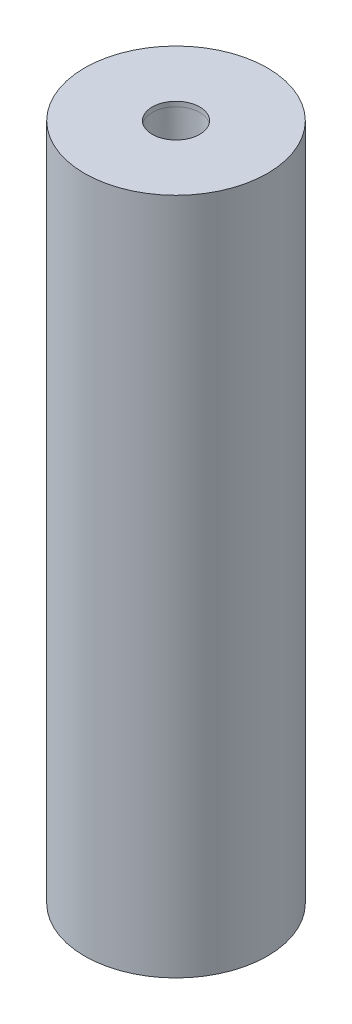
ISO-10303-21;
HEADER;
FILE_DESCRIPTION(('STEP AP214'),'2;1');
FILE_NAME('part.step','',(''),(''),'','','');
FILE_SCHEMA(('AUTOMOTIVE_DESIGN { 1 0 10303 214 1 1 1 1 }'));
ENDSEC;
DATA;
#1=APPLICATION_CONTEXT('core data for automotive mechanical design processes');
#2=APPLICATION_PROTOCOL_DEFINITION('international standard','automotive_design',2000,#1);
#3=PRODUCT_CONTEXT('',#1,'mechanical');
#4=PRODUCT('Part','Part','',(#3));
#5=PRODUCT_RELATED_PRODUCT_CATEGORY('part','',(#4));
#6=PRODUCT_DEFINITION_FORMATION('','',#4);
#7=PRODUCT_DEFINITION_CONTEXT('part definition',#1,'design');
#8=PRODUCT_DEFINITION('design','',#6,#7);
#9=PRODUCT_DEFINITION_SHAPE('','',#8);
#10=(LENGTH_UNIT() NAMED_UNIT(*) SI_UNIT(.MILLI.,.METRE.));
#11=(NAMED_UNIT(*) PLANE_ANGLE_UNIT() SI_UNIT($,.RADIAN.));
#12=(NAMED_UNIT(*) SI_UNIT($,.STERADIAN.) SOLID_ANGLE_UNIT());
#13=UNCERTAINTY_MEASURE_WITH_UNIT(LENGTH_MEASURE(1.E-05),#10,'distance_accuracy_value','');
#14=(GEOMETRIC_REPRESENTATION_CONTEXT(3) GLOBAL_UNCERTAINTY_ASSIGNED_CONTEXT((#13)) GLOBAL_UNIT_ASSIGNED_CONTEXT((#10,
#11,#12)) REPRESENTATION_CONTEXT('',''));
#15=CARTESIAN_POINT('',(0.,0.,0.));
#16=DIRECTION('',(0.,0.,1.));
#17=DIRECTION('',(1.,0.,0.));
#18=AXIS2_PLACEMENT_3D('',#15,#16,#17);
#19=CARTESIAN_POINT('',(0.,1.,0.));
#20=DIRECTION('',(0.,-1.,0.));
#21=DIRECTION('',(0.,0.,-1.));
#22=AXIS2_PLACEMENT_3D('',#19,#20,#21);
#23=PLANE('',#22);
#24=CARTESIAN_POINT('',(0.,1.,0.));
#25=DIRECTION('',(0.,-1.,0.));
#26=DIRECTION('',(0.,0.,-1.));
#27=AXIS2_PLACEMENT_3D('',#24,#25,#26);
#28=CIRCLE('',#27,2.51745506492823);
#29=CARTESIAN_POINT('',(0.,1.,-2.51745506492823));
#30=VERTEX_POINT('',#29);
#31=EDGE_CURVE('E10',#30,#30,#28,.T.);
#32=ORIENTED_EDGE('',*,*,#31,.F.);
#33=EDGE_LOOP('',(#32));
#34=FACE_BOUND('',#33,.T.);
#35=ADVANCED_FACE('F39',(#34),#23,.F.);
#36=CARTESIAN_POINT('',(0.,1.,0.));
#37=DIRECTION('',(0.,1.,0.));
#38=DIRECTION('',(0.,0.,1.));
#39=AXIS2_PLACEMENT_3D('',#36,#37,#38);
#40=CONICAL_SURFACE('',#39,2.51745506492823,0.0174532925199535);
#41=CARTESIAN_POINT('',(0.,140.,0.));
#42=DIRECTION('',(0.,-1.,0.));
#43=DIRECTION('',(0.,0.,-1.));
#44=AXIS2_PLACEMENT_3D('',#41,#42,#43);
#45=CIRCLE('',#44,4.94370908995189);
#46=CARTESIAN_POINT('',(0.,140.,-4.94370908995189));
#47=VERTEX_POINT('',#46);
#48=EDGE_CURVE('E44',#47,#47,#45,.T.);
#49=ORIENTED_EDGE('',*,*,#48,.F.);
#50=EDGE_LOOP('',(#49));
#51=FACE_BOUND('',#50,.T.);
#52=ORIENTED_EDGE('',*,*,#31,.T.);
#53=EDGE_LOOP('',(#52));
#54=FACE_BOUND('',#53,.T.);
#55=ADVANCED_FACE('F225',(#51,#54),#40,.F.);
#56=CARTESIAN_POINT('',(0.,0.,0.));
#57=DIRECTION('',(0.,-1.,0.));
#58=DIRECTION('',(0.,0.,-1.));
#59=AXIS2_PLACEMENT_3D('',#56,#57,#58);
#60=CYLINDRICAL_SURFACE('',#59,4.94370908995142);
#61=CARTESIAN_POINT('',(0.,141.,0.));
#62=DIRECTION('',(0.,-1.,0.));
#63=DIRECTION('',(0.,0.,-1.));
#64=AXIS2_PLACEMENT_3D('',#61,#62,#63);
#65=CIRCLE('',#64,4.94370908995096);
#66=CARTESIAN_POINT('',(0.,141.,-4.94370908995096));
#67=VERTEX_POINT('',#66);
#68=EDGE_CURVE('E47',#67,#67,#65,.T.);
#69=ORIENTED_EDGE('',*,*,#68,.F.);
#70=EDGE_LOOP('',(#69));
#71=FACE_BOUND('',#70,.T.);
#72=ORIENTED_EDGE('',*,*,#48,.T.);
#73=EDGE_LOOP('',(#72));
#74=FACE_BOUND('',#73,.T.);
#75=ADVANCED_FACE('F220',(#71,#74),#60,.F.);
#76=CARTESIAN_POINT('',(-19.0210585061275,141.,0.));
#77=DIRECTION('',(0.,-1.,0.));
#78=DIRECTION('',(0.,0.,-1.));
#79=AXIS2_PLACEMENT_3D('',#76,#77,#78);
#80=PLANE('',#79);
#81=CARTESIAN_POINT('',(0.,141.,0.));
#82=DIRECTION('',(0.,-1.,0.));
#83=DIRECTION('',(0.,0.,-1.));
#84=AXIS2_PLACEMENT_3D('',#81,#82,#83);
#85=CIRCLE('',#84,19.0210585061275);
#86=CARTESIAN_POINT('',(0.,141.,-19.0210585061275));
#87=VERTEX_POINT('',#86);
#88=EDGE_CURVE('E52',#87,#87,#85,.T.);
#89=ORIENTED_EDGE('',*,*,#88,.F.);
#90=EDGE_LOOP('',(#89));
#91=FACE_BOUND('',#90,.T.);
#92=ORIENTED_EDGE('',*,*,#68,.T.);
#93=EDGE_LOOP('',(#92));
#94=FACE_BOUND('',#93,.T.);
#95=ADVANCED_FACE('F211',(#91,#94),#80,.F.);
#96=CARTESIAN_POINT('',(0.,0.,0.));
#97=DIRECTION('',(0.,-1.,0.));
#98=DIRECTION('',(0.,0.,-1.));
#99=AXIS2_PLACEMENT_3D('',#96,#97,#98);
#100=CYLINDRICAL_SURFACE('',#99,19.021058506127);
#101=CARTESIAN_POINT('',(0.,0.,0.));
#102=DIRECTION('',(0.,-1.,0.));
#103=DIRECTION('',(0.,0.,-1.));
#104=AXIS2_PLACEMENT_3D('',#101,#102,#103);
#105=CIRCLE('',#104,19.0210585061265);
#106=CARTESIAN_POINT('',(0.,0.,-19.0210585061265));
#107=VERTEX_POINT('',#106);
#108=EDGE_CURVE('E59',#107,#107,#105,.T.);
#109=ORIENTED_EDGE('',*,*,#108,.F.);
#110=EDGE_LOOP('',(#109));
#111=FACE_BOUND('',#110,.T.);
#112=ORIENTED_EDGE('',*,*,#88,.T.);
#113=EDGE_LOOP('',(#112));
#114=FACE_BOUND('',#113,.T.);
#115=ADVANCED_FACE('F202',(#111,#114),#100,.T.);
#116=CARTESIAN_POINT('',(-19.0210585061265,0.,0.));
#117=DIRECTION('',(0.,1.,0.));
#118=DIRECTION('',(0.,0.,1.));
#119=AXIS2_PLACEMENT_3D('',#116,#117,#118);
#120=PLANE('',#119);
#121=CARTESIAN_POINT('',(0.,-1.08469887890646E-13,0.));
#122=DIRECTION('',(0.,-1.,0.));
#123=DIRECTION('',(0.,0.,-1.));
#124=AXIS2_PLACEMENT_3D('',#121,#122,#123);
#125=CIRCLE('',#124,15.5773494161756);
#126=CARTESIAN_POINT('',(0.,-1.08469887890646E-13,-15.5773494161756));
#127=VERTEX_POINT('',#126);
#128=EDGE_CURVE('E64',#127,#127,#125,.T.);
#129=ORIENTED_EDGE('',*,*,#128,.F.);
#130=EDGE_LOOP('',(#129));
#131=FACE_BOUND('',#130,.T.);
#132=ORIENTED_EDGE('',*,*,#108,.T.);
#133=EDGE_LOOP('',(#132));
#134=FACE_BOUND('',#133,.T.);
#135=ADVANCED_FACE('F200',(#131,#134),#120,.F.);
#136=CARTESIAN_POINT('',(0.,-1.08469887890646E-13,0.));
#137=DIRECTION('',(0.,1.,0.));
#138=DIRECTION('',(0.,0.,1.));
#139=AXIS2_PLACEMENT_3D('',#136,#137,#138);
#140=CONICAL_SURFACE('',#139,15.5773494161756,0.0174532925199466);
#141=CARTESIAN_POINT('',(0.,140.,0.));
#142=DIRECTION('',(0.,-1.,0.));
#143=DIRECTION('',(0.,0.,-1.));
#144=AXIS2_PLACEMENT_3D('',#141,#142,#143);
#145=CIRCLE('',#144,18.0210585061266);
#146=CARTESIAN_POINT('',(0.,140.,-18.0210585061266));
#147=VERTEX_POINT('',#146);
#148=EDGE_CURVE('E63',#147,#147,#145,.T.);
#149=ORIENTED_EDGE('',*,*,#148,.F.);
#150=EDGE_LOOP('',(#149));
#151=FACE_BOUND('',#150,.T.);
#152=ORIENTED_EDGE('',*,*,#128,.T.);
#153=EDGE_LOOP('',(#152));
#154=FACE_BOUND('',#153,.T.);
#155=ADVANCED_FACE('F191',(#151,#154),#140,.F.);
#156=CARTESIAN_POINT('',(-18.0210585061266,140.,0.));
#157=DIRECTION('',(0.,1.,0.));
#158=DIRECTION('',(0.,0.,1.));
#159=AXIS2_PLACEMENT_3D('',#156,#157,#158);
#160=PLANE('',#159);
#161=CARTESIAN_POINT('',(0.,140.,0.));
#162=DIRECTION('',(0.,-1.,0.));
#163=DIRECTION('',(0.,0.,-1.));
#164=AXIS2_PLACEMENT_3D('',#161,#162,#163);
#165=CIRCLE('',#164,15.7518734801275);
#166=CARTESIAN_POINT('',(0.,140.,-15.7518734801275));
#167=VERTEX_POINT('',#166);
#168=EDGE_CURVE('E70',#167,#167,#165,.T.);
#169=ORIENTED_EDGE('',*,*,#168,.F.);
#170=EDGE_LOOP('',(#169));
#171=FACE_BOUND('',#170,.T.);
#172=ORIENTED_EDGE('',*,*,#148,.T.);
#173=EDGE_LOOP('',(#172));
#174=FACE_BOUND('',#173,.T.);
#175=ADVANCED_FACE('F186',(#171,#174),#160,.F.);
#176=CARTESIAN_POINT('',(0.,140.,0.));
#177=DIRECTION('',(0.,1.,0.));
#178=DIRECTION('',(0.,0.,1.));
#179=AXIS2_PLACEMENT_3D('',#176,#177,#178);
#180=CONICAL_SURFACE('',#179,15.7518734801275,0.0174532925199535);
#181=CARTESIAN_POINT('',(0.,0.,0.));
#182=DIRECTION('',(0.,-1.,0.));
#183=DIRECTION('',(0.,0.,-1.));
#184=AXIS2_PLACEMENT_3D('',#181,#182,#183);
#185=CIRCLE('',#184,13.3081643901756);
#186=CARTESIAN_POINT('',(0.,0.,-13.3081643901756));
#187=VERTEX_POINT('',#186);
#188=EDGE_CURVE('E67',#187,#187,#185,.T.);
#189=ORIENTED_EDGE('',*,*,#188,.F.);
#190=EDGE_LOOP('',(#189));
#191=FACE_BOUND('',#190,.T.);
#192=ORIENTED_EDGE('',*,*,#168,.T.);
#193=EDGE_LOOP('',(#192));
#194=FACE_BOUND('',#193,.T.);
#195=ADVANCED_FACE('F182',(#191,#194),#180,.T.);
#196=CARTESIAN_POINT('',(-13.3081643901756,0.,0.));
#197=DIRECTION('',(0.,1.,0.));
#198=DIRECTION('',(0.,0.,1.));
#199=AXIS2_PLACEMENT_3D('',#196,#197,#198);
#200=PLANE('',#199);
#201=CARTESIAN_POINT('',(0.,0.,0.));
#202=DIRECTION('',(0.,-1.,0.));
#203=DIRECTION('',(0.,0.,-1.));
#204=AXIS2_PLACEMENT_3D('',#201,#202,#203);
#205=CIRCLE('',#204,12.3080120621317);
#206=CARTESIAN_POINT('',(0.,0.,-12.3080120621317));
#207=VERTEX_POINT('',#206);
#208=EDGE_CURVE('E71',#207,#207,#205,.T.);
#209=ORIENTED_EDGE('',*,*,#208,.F.);
#210=EDGE_LOOP('',(#209));
#211=FACE_BOUND('',#210,.T.);
#212=ORIENTED_EDGE('',*,*,#188,.T.);
#213=EDGE_LOOP('',(#212));
#214=FACE_BOUND('',#213,.T.);
#215=ADVANCED_FACE('F172',(#211,#214),#200,.F.);
#216=CARTESIAN_POINT('',(0.,0.,0.));
#217=DIRECTION('',(0.,1.,0.));
#218=DIRECTION('',(0.,0.,1.));
#219=AXIS2_PLACEMENT_3D('',#216,#217,#218);
#220=CONICAL_SURFACE('',#219,12.3080120621317,0.0174532925199534);
#221=CARTESIAN_POINT('',(0.,140.,0.));
#222=DIRECTION('',(0.,-1.,0.));
#223=DIRECTION('',(0.,0.,-1.));
#224=AXIS2_PLACEMENT_3D('',#221,#222,#223);
#225=CIRCLE('',#224,14.7517211520836);
#226=CARTESIAN_POINT('',(0.,140.,-14.7517211520836));
#227=VERTEX_POINT('',#226);
#228=EDGE_CURVE('E79',#227,#227,#225,.T.);
#229=ORIENTED_EDGE('',*,*,#228,.F.);
#230=EDGE_LOOP('',(#229));
#231=FACE_BOUND('',#230,.T.);
#232=ORIENTED_EDGE('',*,*,#208,.T.);
#233=EDGE_LOOP('',(#232));
#234=FACE_BOUND('',#233,.T.);
#235=ADVANCED_FACE('F166',(#231,#234),#220,.F.);
#236=CARTESIAN_POINT('',(-14.7517211520836,140.,0.));
#237=DIRECTION('',(0.,1.,0.));
#238=DIRECTION('',(0.,0.,1.));
#239=AXIS2_PLACEMENT_3D('',#236,#237,#238);
#240=PLANE('',#239);
#241=CARTESIAN_POINT('',(0.,140.,0.));
#242=DIRECTION('',(0.,-1.,0.));
#243=DIRECTION('',(0.,0.,-1.));
#244=AXIS2_PLACEMENT_3D('',#241,#242,#243);
#245=CIRCLE('',#244,12.4825361260836);
#246=CARTESIAN_POINT('',(0.,140.,-12.4825361260836));
#247=VERTEX_POINT('',#246);
#248=EDGE_CURVE('E78',#247,#247,#245,.T.);
#249=ORIENTED_EDGE('',*,*,#248,.F.);
#250=EDGE_LOOP('',(#249));
#251=FACE_BOUND('',#250,.T.);
#252=ORIENTED_EDGE('',*,*,#228,.T.);
#253=EDGE_LOOP('',(#252));
#254=FACE_BOUND('',#253,.T.);
#255=ADVANCED_FACE('F162',(#251,#254),#240,.F.);
#256=CARTESIAN_POINT('',(0.,140.,0.));
#257=DIRECTION('',(0.,1.,0.));
#258=DIRECTION('',(0.,0.,1.));
#259=AXIS2_PLACEMENT_3D('',#256,#257,#258);
#260=CONICAL_SURFACE('',#259,12.4825361260836,0.0174532925199535);
#261=CARTESIAN_POINT('',(0.,0.,0.));
#262=DIRECTION('',(0.,-1.,0.));
#263=DIRECTION('',(0.,0.,-1.));
#264=AXIS2_PLACEMENT_3D('',#261,#262,#263);
#265=CIRCLE('',#264,10.0388270361317);
#266=CARTESIAN_POINT('',(0.,0.,-10.0388270361317));
#267=VERTEX_POINT('',#266);
#268=EDGE_CURVE('E85',#267,#267,#265,.T.);
#269=ORIENTED_EDGE('',*,*,#268,.F.);
#270=EDGE_LOOP('',(#269));
#271=FACE_BOUND('',#270,.T.);
#272=ORIENTED_EDGE('',*,*,#248,.T.);
#273=EDGE_LOOP('',(#272));
#274=FACE_BOUND('',#273,.T.);
#275=ADVANCED_FACE('F160',(#271,#274),#260,.T.);
#276=CARTESIAN_POINT('',(-10.0388270361317,0.,0.));
#277=DIRECTION('',(0.,1.,0.));
#278=DIRECTION('',(0.,0.,1.));
#279=AXIS2_PLACEMENT_3D('',#276,#277,#278);
#280=PLANE('',#279);
#281=CARTESIAN_POINT('',(0.,0.,0.));
#282=DIRECTION('',(0.,-1.,0.));
#283=DIRECTION('',(0.,0.,-1.));
#284=AXIS2_PLACEMENT_3D('',#281,#282,#283);
#285=CIRCLE('',#284,9.03867470808782);
#286=CARTESIAN_POINT('',(0.,0.,-9.03867470808782));
#287=VERTEX_POINT('',#286);
#288=EDGE_CURVE('E82',#287,#287,#285,.T.);
#289=ORIENTED_EDGE('',*,*,#288,.F.);
#290=EDGE_LOOP('',(#289));
#291=FACE_BOUND('',#290,.T.);
#292=ORIENTED_EDGE('',*,*,#268,.T.);
#293=EDGE_LOOP('',(#292));
#294=FACE_BOUND('',#293,.T.);
#295=ADVANCED_FACE('F151',(#291,#294),#280,.F.);
#296=CARTESIAN_POINT('',(0.,0.,0.));
#297=DIRECTION('',(0.,1.,0.));
#298=DIRECTION('',(0.,0.,1.));
#299=AXIS2_PLACEMENT_3D('',#296,#297,#298);
#300=CONICAL_SURFACE('',#299,9.03867470808782,0.0174532925199534);
#301=CARTESIAN_POINT('',(0.,140.,0.));
#302=DIRECTION('',(0.,-1.,0.));
#303=DIRECTION('',(0.,0.,-1.));
#304=AXIS2_PLACEMENT_3D('',#301,#302,#303);
#305=CIRCLE('',#304,11.4823837980397);
#306=CARTESIAN_POINT('',(0.,140.,-11.4823837980397));
#307=VERTEX_POINT('',#306);
#308=EDGE_CURVE('E86',#307,#307,#305,.T.);
#309=ORIENTED_EDGE('',*,*,#308,.F.);
#310=EDGE_LOOP('',(#309));
#311=FACE_BOUND('',#310,.T.);
#312=ORIENTED_EDGE('',*,*,#288,.T.);
#313=EDGE_LOOP('',(#312));
#314=FACE_BOUND('',#313,.T.);
#315=ADVANCED_FACE('F144',(#311,#314),#300,.F.);
#316=CARTESIAN_POINT('',(-11.4823837980397,140.,0.));
#317=DIRECTION('',(0.,1.,0.));
#318=DIRECTION('',(0.,0.,1.));
#319=AXIS2_PLACEMENT_3D('',#316,#317,#318);
#320=PLANE('',#319);
#321=CARTESIAN_POINT('',(0.,140.,0.));
#322=DIRECTION('',(0.,-1.,0.));
#323=DIRECTION('',(0.,0.,-1.));
#324=AXIS2_PLACEMENT_3D('',#321,#322,#323);
#325=CIRCLE('',#324,9.2131987720397);
#326=CARTESIAN_POINT('',(0.,140.,-9.2131987720397));
#327=VERTEX_POINT('',#326);
#328=EDGE_CURVE('E93',#327,#327,#325,.T.);
#329=ORIENTED_EDGE('',*,*,#328,.F.);
#330=EDGE_LOOP('',(#329));
#331=FACE_BOUND('',#330,.T.);
#332=ORIENTED_EDGE('',*,*,#308,.T.);
#333=EDGE_LOOP('',(#332));
#334=FACE_BOUND('',#333,.T.);
#335=ADVANCED_FACE('F139',(#331,#334),#320,.F.);
#336=CARTESIAN_POINT('',(0.,140.,0.));
#337=DIRECTION('',(0.,1.,0.));
#338=DIRECTION('',(0.,0.,1.));
#339=AXIS2_PLACEMENT_3D('',#336,#337,#338);
#340=CONICAL_SURFACE('',#339,9.2131987720397,0.0174532925199535);
#341=CARTESIAN_POINT('',(0.,0.,0.));
#342=DIRECTION('',(0.,-1.,0.));
#343=DIRECTION('',(0.,0.,-1.));
#344=AXIS2_PLACEMENT_3D('',#341,#342,#343);
#345=CIRCLE('',#344,6.76948968208781);
#346=CARTESIAN_POINT('',(0.,0.,-6.76948968208781));
#347=VERTEX_POINT('',#346);
#348=EDGE_CURVE('E94',#347,#347,#345,.T.);
#349=ORIENTED_EDGE('',*,*,#348,.F.);
#350=EDGE_LOOP('',(#349));
#351=FACE_BOUND('',#350,.T.);
#352=ORIENTED_EDGE('',*,*,#328,.T.);
#353=EDGE_LOOP('',(#352));
#354=FACE_BOUND('',#353,.T.);
#355=ADVANCED_FACE('F135',(#351,#354),#340,.T.);
#356=CARTESIAN_POINT('',(-6.76948968208781,0.,0.));
#357=DIRECTION('',(0.,1.,0.));
#358=DIRECTION('',(0.,0.,1.));
#359=AXIS2_PLACEMENT_3D('',#356,#357,#358);
#360=PLANE('',#359);
#361=CARTESIAN_POINT('',(0.,0.,0.));
#362=DIRECTION('',(0.,-1.,0.));
#363=DIRECTION('',(0.,0.,-1.));
#364=AXIS2_PLACEMENT_3D('',#361,#362,#363);
#365=CIRCLE('',#364,5.76933735404391);
#366=CARTESIAN_POINT('',(0.,0.,-5.76933735404391));
#367=VERTEX_POINT('',#366);
#368=EDGE_CURVE('E100',#367,#367,#365,.T.);
#369=ORIENTED_EDGE('',*,*,#368,.F.);
#370=EDGE_LOOP('',(#369));
#371=FACE_BOUND('',#370,.T.);
#372=ORIENTED_EDGE('',*,*,#348,.T.);
#373=EDGE_LOOP('',(#372));
#374=FACE_BOUND('',#373,.T.);
#375=ADVANCED_FACE('F130',(#371,#374),#360,.F.);
#376=CARTESIAN_POINT('',(0.,0.,0.));
#377=DIRECTION('',(0.,1.,0.));
#378=DIRECTION('',(0.,0.,1.));
#379=AXIS2_PLACEMENT_3D('',#376,#377,#378);
#380=CONICAL_SURFACE('',#379,5.76933735404391,0.0174532925199535);
#381=CARTESIAN_POINT('',(0.,140.,0.));
#382=DIRECTION('',(0.,-1.,0.));
#383=DIRECTION('',(0.,0.,-1.));
#384=AXIS2_PLACEMENT_3D('',#381,#382,#383);
#385=CIRCLE('',#384,8.21304644399579);
#386=CARTESIAN_POINT('',(0.,140.,-8.21304644399579));
#387=VERTEX_POINT('',#386);
#388=EDGE_CURVE('E99',#387,#387,#385,.T.);
#389=ORIENTED_EDGE('',*,*,#388,.F.);
#390=EDGE_LOOP('',(#389));
#391=FACE_BOUND('',#390,.T.);
#392=ORIENTED_EDGE('',*,*,#368,.T.);
#393=EDGE_LOOP('',(#392));
#394=FACE_BOUND('',#393,.T.);
#395=ADVANCED_FACE('F123',(#391,#394),#380,.F.);
#396=CARTESIAN_POINT('',(-8.21304644399579,140.,0.));
#397=DIRECTION('',(0.,1.,0.));
#398=DIRECTION('',(0.,0.,1.));
#399=AXIS2_PLACEMENT_3D('',#396,#397,#398);
#400=PLANE('',#399);
#401=CARTESIAN_POINT('',(0.,140.,0.));
#402=DIRECTION('',(0.,-1.,0.));
#403=DIRECTION('',(0.,0.,-1.));
#404=AXIS2_PLACEMENT_3D('',#401,#402,#403);
#405=CIRCLE('',#404,5.94386141799579);
#406=CARTESIAN_POINT('',(0.,140.,-5.94386141799579));
#407=VERTEX_POINT('',#406);
#408=EDGE_CURVE('E103',#407,#407,#405,.T.);
#409=ORIENTED_EDGE('',*,*,#408,.F.);
#410=EDGE_LOOP('',(#409));
#411=FACE_BOUND('',#410,.T.);
#412=ORIENTED_EDGE('',*,*,#388,.T.);
#413=EDGE_LOOP('',(#412));
#414=FACE_BOUND('',#413,.T.);
#415=ADVANCED_FACE('F113',(#411,#414),#400,.F.);
#416=CARTESIAN_POINT('',(0.,140.,0.));
#417=DIRECTION('',(0.,1.,0.));
#418=DIRECTION('',(0.,0.,1.));
#419=AXIS2_PLACEMENT_3D('',#416,#417,#418);
#420=CONICAL_SURFACE('',#419,5.94386141799579,0.0174532925199534);
#421=CARTESIAN_POINT('',(0.,0.,0.));
#422=DIRECTION('',(0.,-1.,0.));
#423=DIRECTION('',(0.,0.,-1.));
#424=AXIS2_PLACEMENT_3D('',#421,#422,#423);
#425=CIRCLE('',#424,3.50015232804392);
#426=CARTESIAN_POINT('',(0.,0.,-3.50015232804392));
#427=VERTEX_POINT('',#426);
#428=EDGE_CURVE('E106',#427,#427,#425,.T.);
#429=ORIENTED_EDGE('',*,*,#428,.F.);
#430=EDGE_LOOP('',(#429));
#431=FACE_BOUND('',#430,.T.);
#432=ORIENTED_EDGE('',*,*,#408,.T.);
#433=EDGE_LOOP('',(#432));
#434=FACE_BOUND('',#433,.T.);
#435=ADVANCED_FACE('F115',(#431,#434),#420,.T.);
#436=CARTESIAN_POINT('',(-2.5,0.,0.));
#437=DIRECTION('',(0.,1.,0.));
#438=DIRECTION('',(0.,0.,1.));
#439=AXIS2_PLACEMENT_3D('',#436,#437,#438);
#440=PLANE('',#439);
#441=ORIENTED_EDGE('',*,*,#428,.T.);
#442=EDGE_LOOP('',(#441));
#443=FACE_BOUND('',#442,.T.);
#444=ADVANCED_FACE('F109',(#443),#440,.F.);
#445=CLOSED_SHELL('',(#35,#55,#75,#95,#115,#135,#155,#175,#195,#215,#235,#255,#275,#295,#315,
#335,#355,#375,#395,#415,#435,#444));
#446=MANIFOLD_SOLID_BREP('B2',#445);
#447=ADVANCED_BREP_SHAPE_REPRESENTATION('',(#18,#446),#14);
#448=SHAPE_DEFINITION_REPRESENTATION(#9,#447);
ENDSEC;
END-ISO-10303-21;
